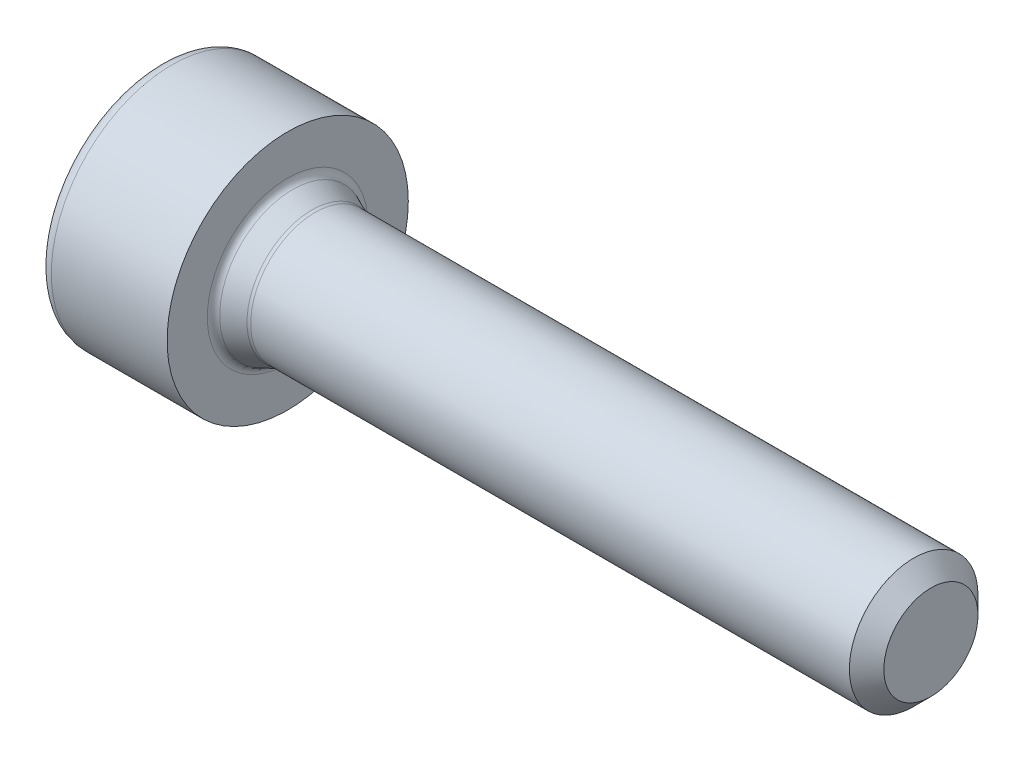
ISO-10303-21;
HEADER;
FILE_DESCRIPTION(('STEP AP214'),'2;1');
FILE_NAME('part.step','',(''),(''),'','','');
FILE_SCHEMA(('AUTOMOTIVE_DESIGN { 1 0 10303 214 1 1 1 1 }'));
ENDSEC;
DATA;
#1=APPLICATION_CONTEXT('core data for automotive mechanical design processes');
#2=APPLICATION_PROTOCOL_DEFINITION('international standard','automotive_design',2000,#1);
#3=PRODUCT_CONTEXT('',#1,'mechanical');
#4=PRODUCT('Part','Part','',(#3));
#5=PRODUCT_RELATED_PRODUCT_CATEGORY('part','',(#4));
#6=PRODUCT_DEFINITION_FORMATION('','',#4);
#7=PRODUCT_DEFINITION_CONTEXT('part definition',#1,'design');
#8=PRODUCT_DEFINITION('design','',#6,#7);
#9=PRODUCT_DEFINITION_SHAPE('','',#8);
#10=(LENGTH_UNIT() NAMED_UNIT(*) SI_UNIT(.MILLI.,.METRE.));
#11=(NAMED_UNIT(*) PLANE_ANGLE_UNIT() SI_UNIT($,.RADIAN.));
#12=(NAMED_UNIT(*) SI_UNIT($,.STERADIAN.) SOLID_ANGLE_UNIT());
#13=UNCERTAINTY_MEASURE_WITH_UNIT(LENGTH_MEASURE(1.E-05),#10,'distance_accuracy_value','');
#14=(GEOMETRIC_REPRESENTATION_CONTEXT(3) GLOBAL_UNCERTAINTY_ASSIGNED_CONTEXT((#13)) GLOBAL_UNIT_ASSIGNED_CONTEXT((#10,
#11,#12)) REPRESENTATION_CONTEXT('',''));
#15=CARTESIAN_POINT('',(0.,0.,0.));
#16=DIRECTION('',(0.,0.,1.));
#17=DIRECTION('',(1.,0.,0.));
#18=AXIS2_PLACEMENT_3D('',#15,#16,#17);
#19=CARTESIAN_POINT('',(-0.9,0.,0.));
#20=DIRECTION('',(-1.,0.,0.));
#21=DIRECTION('',(0.,0.,1.));
#22=AXIS2_PLACEMENT_3D('',#19,#20,#21);
#23=CONICAL_SURFACE('',#22,0.75,1.0471975511966);
#24=CARTESIAN_POINT('',(-0.9,0.,0.));
#25=DIRECTION('',(1.,0.,0.));
#26=DIRECTION('',(0.,0.,-1.));
#27=AXIS2_PLACEMENT_3D('',#24,#25,#26);
#28=CIRCLE('',#27,0.75);
#29=CARTESIAN_POINT('',(-0.9,0.,-0.75));
#30=VERTEX_POINT('',#29);
#31=CARTESIAN_POINT('',(-0.9,0.649519052838329,-0.375));
#32=VERTEX_POINT('',#31);
#33=EDGE_CURVE('E318',#30,#32,#28,.T.);
#34=ORIENTED_EDGE('',*,*,#33,.F.);
#35=CARTESIAN_POINT('',(-0.9,0.,0.));
#36=DIRECTION('',(1.,0.,0.));
#37=DIRECTION('',(0.,0.,1.));
#38=AXIS2_PLACEMENT_3D('',#35,#36,#37);
#39=CIRCLE('',#38,0.75);
#40=CARTESIAN_POINT('',(-0.9,-0.649519052838329,-0.375));
#41=VERTEX_POINT('',#40);
#42=EDGE_CURVE('E311',#41,#30,#39,.T.);
#43=ORIENTED_EDGE('',*,*,#42,.F.);
#44=CARTESIAN_POINT('',(-0.9,0.,0.));
#45=DIRECTION('',(1.,0.,0.));
#46=DIRECTION('',(0.,0.,1.));
#47=AXIS2_PLACEMENT_3D('',#44,#45,#46);
#48=CIRCLE('',#47,0.75);
#49=CARTESIAN_POINT('',(-0.9,-0.649519052838329,0.375));
#50=VERTEX_POINT('',#49);
#51=EDGE_CURVE('E620',#50,#41,#48,.T.);
#52=ORIENTED_EDGE('',*,*,#51,.F.);
#53=CARTESIAN_POINT('',(-0.9,0.,0.));
#54=DIRECTION('',(1.,0.,0.));
#55=DIRECTION('',(0.,0.,1.));
#56=AXIS2_PLACEMENT_3D('',#53,#54,#55);
#57=CIRCLE('',#56,0.75);
#58=CARTESIAN_POINT('',(-0.9,0.,0.75));
#59=VERTEX_POINT('',#58);
#60=EDGE_CURVE('E623',#59,#50,#57,.T.);
#61=ORIENTED_EDGE('',*,*,#60,.F.);
#62=CARTESIAN_POINT('',(-0.9,0.,0.));
#63=DIRECTION('',(1.,0.,0.));
#64=DIRECTION('',(0.,0.,1.));
#65=AXIS2_PLACEMENT_3D('',#62,#63,#64);
#66=CIRCLE('',#65,0.75);
#67=CARTESIAN_POINT('',(-0.9,0.649519052838329,0.375));
#68=VERTEX_POINT('',#67);
#69=EDGE_CURVE('E11',#68,#59,#66,.T.);
#70=ORIENTED_EDGE('',*,*,#69,.F.);
#71=CARTESIAN_POINT('',(-0.9,0.,0.));
#72=DIRECTION('',(1.,0.,0.));
#73=DIRECTION('',(0.,0.,1.));
#74=AXIS2_PLACEMENT_3D('',#71,#72,#73);
#75=CIRCLE('',#74,0.75);
#76=EDGE_CURVE('E279',#32,#68,#75,.T.);
#77=ORIENTED_EDGE('',*,*,#76,.F.);
#78=EDGE_LOOP('',(#34,#43,#52,#61,#70,#77));
#79=FACE_BOUND('',#78,.T.);
#80=CARTESIAN_POINT('',(-0.466987298107781,0.,0.));
#81=VERTEX_POINT('',#80);
#82=VERTEX_LOOP('',#81);
#83=FACE_BOUND('',#82,.T.);
#84=ADVANCED_FACE('F16',(#79,#83),#23,.F.);
#85=CARTESIAN_POINT('',(-0.9,0.75,0.));
#86=DIRECTION('',(-1.,0.,0.));
#87=DIRECTION('',(0.,0.,1.));
#88=AXIS2_PLACEMENT_3D('',#85,#86,#87);
#89=PLANE('',#88);
#90=DIRECTION('',(0.,-0.5,0.866025403784439));
#91=VECTOR('',#90,1.);
#92=CARTESIAN_POINT('',(-0.9,0.866025403784439,0.));
#93=LINE('',#92,#91);
#94=CARTESIAN_POINT('',(-0.9,0.433012701892219,0.75));
#95=VERTEX_POINT('',#94);
#96=EDGE_CURVE('E28',#68,#95,#93,.T.);
#97=ORIENTED_EDGE('',*,*,#96,.F.);
#98=ORIENTED_EDGE('',*,*,#69,.T.);
#99=DIRECTION('',(0.,-1.,0.));
#100=VECTOR('',#99,1.);
#101=CARTESIAN_POINT('',(-0.9,0.433012701892219,0.75));
#102=LINE('',#101,#100);
#103=EDGE_CURVE('E116',#95,#59,#102,.T.);
#104=ORIENTED_EDGE('',*,*,#103,.F.);
#105=EDGE_LOOP('',(#97,#98,#104));
#106=FACE_BOUND('',#105,.T.);
#107=ADVANCED_FACE('F18',(#106),#89,.T.);
#108=CARTESIAN_POINT('',(-0.9,0.866025403784439,0.));
#109=DIRECTION('',(0.,-0.866025403784439,-0.5));
#110=DIRECTION('',(0.,0.5,-0.866025403784439));
#111=AXIS2_PLACEMENT_3D('',#108,#109,#110);
#112=PLANE('',#111);
#113=CARTESIAN_POINT('',(-1.58904501176617,0.866025403782683,-5.78758739838344E-13));
#114=CARTESIAN_POINT('',(-1.58367531613561,0.856723474156551,0.0161105205743026));
#115=CARTESIAN_POINT('',(-1.57854220470905,0.84738450763052,0.0322814872921372));
#116=CARTESIAN_POINT('',(-1.56897580041662,0.828935657126255,0.0642729405519347));
#117=CARTESIAN_POINT('',(-1.56452615681788,0.819827285483137,0.0800894255372696));
#118=CARTESIAN_POINT('',(-1.55632470104139,0.801806998337829,0.111473630036228));
#119=CARTESIAN_POINT('',(-1.55255844098719,0.792895748391182,0.127037926390042));
#120=CARTESIAN_POINT('',(-1.54572175112771,0.775220861861013,0.158023870009516));
#121=CARTESIAN_POINT('',(-1.54264016162135,0.766457411337308,0.173443148980513));
#122=CARTESIAN_POINT('',(-1.53716899215381,0.749009737194211,0.20424921261375));
#123=CARTESIAN_POINT('',(-1.53477305532817,0.740325560294707,0.219634889191484));
#124=CARTESIAN_POINT('',(-1.53066792088133,0.722945779473704,0.250484378573551));
#125=CARTESIAN_POINT('',(-1.52895848861601,0.714250180477494,0.265948162848017));
#126=CARTESIAN_POINT('',(-1.52621989095727,0.696732411765656,0.297061699794271));
#127=CARTESIAN_POINT('',(-1.5251974313371,0.687909829363522,0.312711809862034));
#128=CARTESIAN_POINT('',(-1.52382556634571,0.669996724020713,0.344298582621984));
#129=CARTESIAN_POINT('',(-1.52348988324408,0.660904354086726,0.360234785944158));
#130=CARTESIAN_POINT('',(-1.5234852263274,0.642551029489878,0.392020450873912));
#131=CARTESIAN_POINT('',(-1.52381658291048,0.633289993534913,0.407869865594268));
#132=CARTESIAN_POINT('',(-1.52518115027885,0.614880324039069,0.43919075916239));
#133=CARTESIAN_POINT('',(-1.52620060432808,0.605733000926372,0.454663599548));
#134=CARTESIAN_POINT('',(-1.52893439533168,0.587536787625666,0.485406031007776));
#135=CARTESIAN_POINT('',(-1.53064202248997,0.578487789606331,0.500676154434751));
#136=CARTESIAN_POINT('',(-1.53474475290455,0.560451924019377,0.531168265230114));
#137=CARTESIAN_POINT('',(-1.53714011485072,0.551465081136355,0.546390232302254));
#138=CARTESIAN_POINT('',(-1.54261130390451,0.533500857145195,0.576921281388262));
#139=CARTESIAN_POINT('',(-1.54569353528851,0.524524421858133,0.592229766578065));
#140=CARTESIAN_POINT('',(-1.55253266004756,0.506517382166265,0.623049878304814));
#141=CARTESIAN_POINT('',(-1.55630077603232,0.497488748182276,0.638560153373553));
#142=CARTESIAN_POINT('',(-1.56450707862101,0.479308068903913,0.669881243679906));
#143=CARTESIAN_POINT('',(-1.56895978288347,0.47015866433642,0.685689757997303));
#144=CARTESIAN_POINT('',(-1.57853345250863,0.451664094576124,0.717688588002265));
#145=CARTESIAN_POINT('',(-1.58367083878027,0.442321638119278,0.733875572129299));
#146=CARTESIAN_POINT('',(-1.58904501176668,0.433012701891488,0.749999999999412));
#147=B_SPLINE_CURVE_WITH_KNOTS('',3,(#113,#114,#115,#116,#117,#118,#119,#120,#121,#122,#123,
#124,#125,#126,#127,#128,#129,#130,#131,#132,#133,#134,#135,#136,#137,#138,#139,#140,#141,#142,
#143,#144,#145,#146),.UNSPECIFIED.,.F.,.F.,(4,2,2,2,2,2,2,2,2,2,2,2,2,2,2,2,4),(0.,
0.0580897344636607,0.114440335586993,0.169407773207459,0.223399996272083,0.276874101131342,
0.33032991319819,0.384300225592538,0.439338768230825,0.494404579270198,0.548400876597368,
0.601882969120034,0.65538520522544,0.709408872876216,0.764412383870848,0.820804823497777,
0.878943109631919),.UNSPECIFIED.);
#148=CARTESIAN_POINT('',(-1.58904501176718,0.866025403784439,0.));
#149=VERTEX_POINT('',#148);
#150=CARTESIAN_POINT('',(-1.58904501176718,0.433012701892219,0.75));
#151=VERTEX_POINT('',#150);
#152=EDGE_CURVE('E262',#149,#151,#147,.T.);
#153=ORIENTED_EDGE('',*,*,#152,.F.);
#154=DIRECTION('',(-1.,0.,0.));
#155=VECTOR('',#154,1.);
#156=CARTESIAN_POINT('',(-0.9,0.866025403784439,0.));
#157=LINE('',#156,#155);
#158=CARTESIAN_POINT('',(-0.9,0.866025403784439,0.));
#159=VERTEX_POINT('',#158);
#160=EDGE_CURVE('E123',#159,#149,#157,.T.);
#161=ORIENTED_EDGE('',*,*,#160,.F.);
#162=DIRECTION('',(0.,-0.5,0.866025403784439));
#163=VECTOR('',#162,1.);
#164=CARTESIAN_POINT('',(-0.9,0.866025403784439,0.));
#165=LINE('',#164,#163);
#166=EDGE_CURVE('E271',#159,#68,#165,.T.);
#167=ORIENTED_EDGE('',*,*,#166,.T.);
#168=ORIENTED_EDGE('',*,*,#96,.T.);
#169=DIRECTION('',(-1.,0.,0.));
#170=VECTOR('',#169,1.);
#171=CARTESIAN_POINT('',(-0.9,0.433012701892219,0.75));
#172=LINE('',#171,#170);
#173=EDGE_CURVE('E107',#95,#151,#172,.T.);
#174=ORIENTED_EDGE('',*,*,#173,.T.);
#175=EDGE_LOOP('',(#153,#161,#167,#168,#174));
#176=FACE_BOUND('',#175,.T.);
#177=ADVANCED_FACE('F402',(#176),#112,.T.);
#178=CARTESIAN_POINT('',(-0.9,0.433012701892219,-0.75));
#179=DIRECTION('',(0.,-0.866025403784439,0.5));
#180=DIRECTION('',(-1.,0.,0.));
#181=AXIS2_PLACEMENT_3D('',#178,#179,#180);
#182=PLANE('',#181);
#183=CARTESIAN_POINT('',(-1.58904501176617,0.433012701890843,-0.749999999998768));
#184=CARTESIAN_POINT('',(-1.58367531613567,0.442313857163721,-0.733889032351043));
#185=CARTESIAN_POINT('',(-1.57854220470916,0.451648841882024,-0.71771576673566));
#186=CARTESIAN_POINT('',(-1.56897580041683,0.470129827856745,-0.68574286689874));
#187=CARTESIAN_POINT('',(-1.56452615681813,0.479273119831028,-0.669946543176147));
#188=CARTESIAN_POINT('',(-1.5563247010417,0.497442494632006,-0.638648414475542));
#189=CARTESIAN_POINT('',(-1.55255844098752,0.506465945693117,-0.623148897465443));
#190=CARTESIAN_POINT('',(-1.54572175112808,0.524463116762755,-0.592349024911677));
#191=CARTESIAN_POINT('',(-1.54264016162172,0.533434878797849,-0.57705001464787));
#192=CARTESIAN_POINT('',(-1.53716899215418,0.551389875423344,-0.546536853786382));
#193=CARTESIAN_POINT('',(-1.53477305532854,0.560372173744356,-0.531323297691564));
#194=CARTESIAN_POINT('',(-1.53066792088167,0.578398724832574,-0.500847221297241));
#195=CARTESIAN_POINT('',(-1.52895848861632,0.587442955354833,-0.485584719528094));
#196=CARTESIAN_POINT('',(-1.52621989095752,0.605629184396017,-0.4548571183327));
#197=CARTESIAN_POINT('',(-1.52519743133731,0.614771286085682,-0.439391482811466));
#198=CARTESIAN_POINT('',(-1.52382556634582,0.633169681047983,-0.408084892143652));
#199=CARTESIAN_POINT('',(-1.52348988324413,0.64242465299786,-0.392242567138949));
#200=CARTESIAN_POINT('',(-1.52348522632734,0.660775184004618,-0.360455289329204));
#201=CARTESIAN_POINT('',(-1.52381658291036,0.669870661809922,-0.34451028956675));
#202=CARTESIAN_POINT('',(-1.52518115027863,0.687790516560974,-0.312906601324182));
#203=CARTESIAN_POINT('',(-1.52620060432783,0.696616727847172,-0.297248366939241));
#204=CARTESIAN_POINT('',(-1.52893439533137,0.714142347814949,-0.266118768238413));
#205=CARTESIAN_POINT('',(-1.53064202248963,0.72284216361192,-0.250647044361453));
#206=CARTESIAN_POINT('',(-1.53474475290418,0.740231173382189,-0.219781471186337));
#207=CARTESIAN_POINT('',(-1.53714011485035,0.748920362120719,-0.204387653413792));
#208=CARTESIAN_POINT('',(-1.54261130390413,0.766378914237847,-0.17356465453522));
#209=CARTESIAN_POINT('',(-1.54569353528814,0.77514823366218,-0.158136590946302));
#210=CARTESIAN_POINT('',(-1.55253266004722,0.792835713519189,-0.127131981262786));
#211=CARTESIAN_POINT('',(-1.55630077603201,0.801753688756474,-0.111557817336774));
#212=CARTESIAN_POINT('',(-1.56450707862076,0.819788208996979,-0.0801523420703491));
#213=CARTESIAN_POINT('',(-1.56895978288327,0.82890408170828,-0.0643244681266093));
#214=CARTESIAN_POINT('',(-1.57853345250852,0.847368596504008,-0.0323082858794039));
#215=CARTESIAN_POINT('',(-1.58367083878022,0.856715707740358,-0.0161239891903555));
#216=CARTESIAN_POINT('',(-1.58904501176668,0.866025403783564,3.39263646639654E-13));
#217=B_SPLINE_CURVE_WITH_KNOTS('',3,(#183,#184,#185,#186,#187,#188,#189,#190,#191,#192,#193,
#194,#195,#196,#197,#198,#199,#200,#201,#202,#203,#204,#205,#206,#207,#208,#209,#210,#211,#212,
#213,#214,#215,#216),.UNSPECIFIED.,.F.,.F.,(4,2,2,2,2,2,2,2,2,2,2,2,2,2,2,2,4),(0.,
0.0580897344630765,0.114440335586018,0.169407773206276,0.223399996270862,0.276874101130235,
0.330329913197332,0.384300225592043,0.439338768230785,0.494404579269703,0.548400876596509,
0.601882969118926,0.655385205224217,0.709408872875031,0.76441238386987,0.820804823497191,
0.878943109631917),.UNSPECIFIED.);
#218=CARTESIAN_POINT('',(-1.58904501176718,0.433012701892219,-0.75));
#219=VERTEX_POINT('',#218);
#220=EDGE_CURVE('E130',#219,#149,#217,.T.);
#221=ORIENTED_EDGE('',*,*,#220,.F.);
#222=DIRECTION('',(-1.,0.,0.));
#223=VECTOR('',#222,1.);
#224=CARTESIAN_POINT('',(-0.9,0.433012701892219,-0.75));
#225=LINE('',#224,#223);
#226=CARTESIAN_POINT('',(-0.9,0.433012701892219,-0.75));
#227=VERTEX_POINT('',#226);
#228=EDGE_CURVE('E244',#227,#219,#225,.T.);
#229=ORIENTED_EDGE('',*,*,#228,.F.);
#230=DIRECTION('',(0.,0.5,0.866025403784439));
#231=VECTOR('',#230,1.);
#232=CARTESIAN_POINT('',(-0.9,0.433012701892219,-0.75));
#233=LINE('',#232,#231);
#234=EDGE_CURVE('E313',#227,#32,#233,.T.);
#235=ORIENTED_EDGE('',*,*,#234,.T.);
#236=DIRECTION('',(0.,0.5,0.866025403784439));
#237=VECTOR('',#236,1.);
#238=CARTESIAN_POINT('',(-0.9,0.433012701892219,-0.75));
#239=LINE('',#238,#237);
#240=EDGE_CURVE('E317',#32,#159,#239,.T.);
#241=ORIENTED_EDGE('',*,*,#240,.T.);
#242=ORIENTED_EDGE('',*,*,#160,.T.);
#243=EDGE_LOOP('',(#221,#229,#235,#241,#242));
#244=FACE_BOUND('',#243,.T.);
#245=ADVANCED_FACE('F494',(#244),#182,.T.);
#246=CARTESIAN_POINT('',(-0.9,-0.433012701892219,-0.75));
#247=DIRECTION('',(0.,0.,1.));
#248=DIRECTION('',(1.,0.,0.));
#249=AXIS2_PLACEMENT_3D('',#246,#247,#248);
#250=PLANE('',#249);
#251=CARTESIAN_POINT('',(-1.58904501176718,-0.433012701892222,-0.749999999999998));
#252=CARTESIAN_POINT('',(-1.5836766178328,-0.414414218634009,-0.749999523021776));
#253=CARTESIAN_POINT('',(-1.57854539094546,-0.395744699761326,-0.749998669196846));
#254=CARTESIAN_POINT('',(-1.56898280315234,-0.358820240384285,-0.750022352782509));
#255=CARTESIAN_POINT('',(-1.56453515468041,-0.340569504010301,-0.750046135044975));
#256=CARTESIAN_POINT('',(-1.55633774328368,-0.304378137843782,-0.750140974612984));
#257=CARTESIAN_POINT('',(-1.55257361978297,-0.286440783248513,-0.750210866250142));
#258=CARTESIAN_POINT('',(-1.54574122348698,-0.250759790476764,-0.750407936177468));
#259=CARTESIAN_POINT('',(-1.5426619045163,-0.233018272192063,-0.7505340882642));
#260=CARTESIAN_POINT('',(-1.53719527340424,-0.197599279685931,-0.750838801374382));
#261=CARTESIAN_POINT('',(-1.53480174068341,-0.17992276591461,-0.751016859660493));
#262=CARTESIAN_POINT('',(-1.53070138843517,-0.144492557517089,-0.751401443551943));
#263=CARTESIAN_POINT('',(-1.52899448543216,-0.126738872538248,-0.751607965692747));
#264=CARTESIAN_POINT('',(-1.52626091765833,-0.0910032782259369,-0.752002919663614));
#265=CARTESIAN_POINT('',(-1.52524111312707,-0.0730208424177079,-0.752191153444209));
#266=CARTESIAN_POINT('',(-1.52387450152645,-0.0366698820758176,-0.752476522891336));
#267=CARTESIAN_POINT('',(-1.52354156123283,-0.0183008282307069,-0.752571761453416));
#268=CARTESIAN_POINT('',(-1.52354238435663,0.0184282188321439,-0.752569857650806));
#269=CARTESIAN_POINT('',(-1.5238758198446,0.0367882120613368,-0.752472809912114));
#270=CARTESIAN_POINT('',(-1.5252433624702,0.0731221315815553,-0.752185035572589));
#271=CARTESIAN_POINT('',(-1.5262636397777,0.0910965862649876,-0.751996178067135));
#272=CARTESIAN_POINT('',(-1.52899790499123,0.126817244120297,-0.751600584592368));
#273=CARTESIAN_POINT('',(-1.53070507304843,0.144563970982512,-0.751394039658522));
#274=CARTESIAN_POINT('',(-1.53480575682571,0.17998122863539,-0.751009859433507));
#275=CARTESIAN_POINT('',(-1.53719939323615,0.19765174547231,-0.750832229234552));
#276=CARTESIAN_POINT('',(-1.54266602457155,0.233059649440022,-0.750528589244018));
#277=CARTESIAN_POINT('',(-1.5457452719356,0.250796070889233,-0.750403087140767));
#278=CARTESIAN_POINT('',(-1.55257732811481,0.286467719094294,-0.75020735368119));
#279=CARTESIAN_POINT('',(-1.55634120821914,0.304400820639449,-0.75013815200652));
#280=CARTESIAN_POINT('',(-1.56453794081843,0.340584480455502,-0.750044552605956));
#281=CARTESIAN_POINT('',(-1.56898517184782,0.358831758940779,-0.750021318897463));
#282=CARTESIAN_POINT('',(-1.57854674645101,0.395750057558846,-0.749998434391471));
#283=CARTESIAN_POINT('',(-1.58367738931713,0.414416870264323,-0.749999530147659));
#284=CARTESIAN_POINT('',(-1.58904501176718,0.433012701892221,-0.749999999999995));
#285=B_SPLINE_CURVE_WITH_KNOTS('',3,(#251,#252,#253,#254,#255,#256,#257,#258,#259,#260,#261,
#262,#263,#264,#265,#266,#267,#268,#269,#270,#271,#272,#273,#274,#275,#276,#277,#278,#279,#280,
#281,#282,#283,#284),.UNSPECIFIED.,.F.,.F.,(4,2,2,2,2,2,2,2,2,2,2,2,2,2,2,2,4),(0.,
0.0580753806633286,0.114421839483928,0.169395773357731,0.223405562650817,0.27690869861218,
0.330405328071952,0.384428471042768,0.43953199397489,0.494608406651249,0.548607746758201,
0.60208368241486,0.655569025628609,0.709563708155784,0.764525006769336,0.820861098110479,
0.878928195887142),.UNSPECIFIED.);
#286=CARTESIAN_POINT('',(-1.58904501176718,-0.433012701892219,-0.75));
#287=VERTEX_POINT('',#286);
#288=EDGE_CURVE('E260',#287,#219,#285,.T.);
#289=ORIENTED_EDGE('',*,*,#288,.F.);
#290=DIRECTION('',(-1.,0.,0.));
#291=VECTOR('',#290,1.);
#292=CARTESIAN_POINT('',(-0.9,-0.433012701892219,-0.75));
#293=LINE('',#292,#291);
#294=CARTESIAN_POINT('',(-0.9,-0.433012701892219,-0.75));
#295=VERTEX_POINT('',#294);
#296=EDGE_CURVE('E236',#295,#287,#293,.T.);
#297=ORIENTED_EDGE('',*,*,#296,.F.);
#298=DIRECTION('',(0.,1.,0.));
#299=VECTOR('',#298,1.);
#300=CARTESIAN_POINT('',(-0.9,-0.433012701892219,-0.75));
#301=LINE('',#300,#299);
#302=EDGE_CURVE('E319',#295,#30,#301,.T.);
#303=ORIENTED_EDGE('',*,*,#302,.T.);
#304=DIRECTION('',(0.,1.,0.));
#305=VECTOR('',#304,1.);
#306=CARTESIAN_POINT('',(-0.9,-0.433012701892219,-0.75));
#307=LINE('',#306,#305);
#308=EDGE_CURVE('E322',#30,#227,#307,.T.);
#309=ORIENTED_EDGE('',*,*,#308,.T.);
#310=ORIENTED_EDGE('',*,*,#228,.T.);
#311=EDGE_LOOP('',(#289,#297,#303,#309,#310));
#312=FACE_BOUND('',#311,.T.);
#313=ADVANCED_FACE('F486',(#312),#250,.T.);
#314=CARTESIAN_POINT('',(-0.9,-0.866025403784439,0.));
#315=DIRECTION('',(0.,0.866025403784439,0.5));
#316=DIRECTION('',(1.,0.,0.));
#317=AXIS2_PLACEMENT_3D('',#314,#315,#316);
#318=PLANE('',#317);
#319=CARTESIAN_POINT('',(-1.58904501176617,-0.866025403782683,5.80575645000851E-13));
#320=CARTESIAN_POINT('',(-1.58367531613561,-0.856723474156551,-0.0161105205743008));
#321=CARTESIAN_POINT('',(-1.57854220470905,-0.84738450763052,-0.0322814872921357));
#322=CARTESIAN_POINT('',(-1.56897580041662,-0.828935657126255,-0.0642729405519336));
#323=CARTESIAN_POINT('',(-1.56452615681788,-0.819827285483137,-0.0800894255372687));
#324=CARTESIAN_POINT('',(-1.55632470104139,-0.801806998337829,-0.111473630036227));
#325=CARTESIAN_POINT('',(-1.55255844098719,-0.792895748391181,-0.127037926390041));
#326=CARTESIAN_POINT('',(-1.54572175112771,-0.775220861861013,-0.158023870009515));
#327=CARTESIAN_POINT('',(-1.54264016162135,-0.766457411337308,-0.173443148980513));
#328=CARTESIAN_POINT('',(-1.53716899215381,-0.749009737194211,-0.20424921261375));
#329=CARTESIAN_POINT('',(-1.53477305532817,-0.740325560294707,-0.219634889191484));
#330=CARTESIAN_POINT('',(-1.53066792088133,-0.722945779473704,-0.250484378573551));
#331=CARTESIAN_POINT('',(-1.52895848861601,-0.714250180477493,-0.265948162848017));
#332=CARTESIAN_POINT('',(-1.52621989095727,-0.696732411765656,-0.297061699794272));
#333=CARTESIAN_POINT('',(-1.5251974313371,-0.687909829363521,-0.312711809862035));
#334=CARTESIAN_POINT('',(-1.52382556634571,-0.669996724020712,-0.344298582621986));
#335=CARTESIAN_POINT('',(-1.52348988324408,-0.660904354086725,-0.360234785944159));
#336=CARTESIAN_POINT('',(-1.5234852263274,-0.642551029489877,-0.392020450873913));
#337=CARTESIAN_POINT('',(-1.52381658291048,-0.633289993534912,-0.407869865594269));
#338=CARTESIAN_POINT('',(-1.52518115027885,-0.614880324039068,-0.439190759162391));
#339=CARTESIAN_POINT('',(-1.52620060432808,-0.605733000926371,-0.454663599548001));
#340=CARTESIAN_POINT('',(-1.52893439533168,-0.587536787625665,-0.485406031007777));
#341=CARTESIAN_POINT('',(-1.53064202248997,-0.57848778960633,-0.500676154434753));
#342=CARTESIAN_POINT('',(-1.53474475290455,-0.560451924019376,-0.531168265230115));
#343=CARTESIAN_POINT('',(-1.53714011485072,-0.551465081136354,-0.546390232302255));
#344=CARTESIAN_POINT('',(-1.54261130390451,-0.533500857145194,-0.576921281388263));
#345=CARTESIAN_POINT('',(-1.54569353528851,-0.524524421858132,-0.592229766578066));
#346=CARTESIAN_POINT('',(-1.55253266004756,-0.506517382166265,-0.623049878304815));
#347=CARTESIAN_POINT('',(-1.55630077603232,-0.497488748182276,-0.638560153373553));
#348=CARTESIAN_POINT('',(-1.56450707862101,-0.479308068903912,-0.669881243679906));
#349=CARTESIAN_POINT('',(-1.56895978288347,-0.470158664336419,-0.685689757997303));
#350=CARTESIAN_POINT('',(-1.57853345250863,-0.451664094576123,-0.717688588002266));
#351=CARTESIAN_POINT('',(-1.58367083878027,-0.442321638119278,-0.733875572129299));
#352=CARTESIAN_POINT('',(-1.58904501176668,-0.433012701891488,-0.749999999999412));
#353=B_SPLINE_CURVE_WITH_KNOTS('',3,(#319,#320,#321,#322,#323,#324,#325,#326,#327,#328,#329,
#330,#331,#332,#333,#334,#335,#336,#337,#338,#339,#340,#341,#342,#343,#344,#345,#346,#347,#348,
#349,#350,#351,#352),.UNSPECIFIED.,.F.,.F.,(4,2,2,2,2,2,2,2,2,2,2,2,2,2,2,2,4),(0.,
0.058089734463661,0.114440335586993,0.16940777320746,0.223399996272085,0.276874101131344,
0.330329913198193,0.384300225592541,0.439338768230828,0.494404579270201,0.548400876597371,
0.601882969120037,0.655385205225443,0.709408872876219,0.76441238387085,0.820804823497779,
0.878943109631921),.UNSPECIFIED.);
#354=CARTESIAN_POINT('',(-1.58904501176718,-0.866025403784439,0.));
#355=VERTEX_POINT('',#354);
#356=EDGE_CURVE('E255',#355,#287,#353,.T.);
#357=ORIENTED_EDGE('',*,*,#356,.F.);
#358=DIRECTION('',(-1.,0.,0.));
#359=VECTOR('',#358,1.);
#360=CARTESIAN_POINT('',(-0.9,-0.866025403784439,0.));
#361=LINE('',#360,#359);
#362=CARTESIAN_POINT('',(-0.9,-0.866025403784439,0.));
#363=VERTEX_POINT('',#362);
#364=EDGE_CURVE('E228',#363,#355,#361,.T.);
#365=ORIENTED_EDGE('',*,*,#364,.F.);
#366=DIRECTION('',(0.,0.5,-0.866025403784439));
#367=VECTOR('',#366,1.);
#368=CARTESIAN_POINT('',(-0.9,-0.866025403784439,0.));
#369=LINE('',#368,#367);
#370=EDGE_CURVE('E312',#363,#41,#369,.T.);
#371=ORIENTED_EDGE('',*,*,#370,.T.);
#372=DIRECTION('',(0.,0.5,-0.866025403784439));
#373=VECTOR('',#372,1.);
#374=CARTESIAN_POINT('',(-0.9,-0.866025403784439,0.));
#375=LINE('',#374,#373);
#376=EDGE_CURVE('E308',#41,#295,#375,.T.);
#377=ORIENTED_EDGE('',*,*,#376,.T.);
#378=ORIENTED_EDGE('',*,*,#296,.T.);
#379=EDGE_LOOP('',(#357,#365,#371,#377,#378));
#380=FACE_BOUND('',#379,.T.);
#381=ADVANCED_FACE('F213',(#380),#318,.T.);
#382=CARTESIAN_POINT('',(-0.9,-0.433012701892219,0.75));
#383=DIRECTION('',(0.,0.866025403784439,-0.5));
#384=DIRECTION('',(-1.,0.,0.));
#385=AXIS2_PLACEMENT_3D('',#382,#383,#384);
#386=PLANE('',#385);
#387=CARTESIAN_POINT('',(-1.58904501176617,-0.433012701890845,0.749999999998766));
#388=CARTESIAN_POINT('',(-1.58367531613566,-0.442313857163741,0.733889032351012));
#389=CARTESIAN_POINT('',(-1.57854220470914,-0.451648841882058,0.717715766735598));
#390=CARTESIAN_POINT('',(-1.56897580041679,-0.470129827856799,0.685742866898625));
#391=CARTESIAN_POINT('',(-1.56452615681809,-0.479273119831087,0.669946543176009));
#392=CARTESIAN_POINT('',(-1.55632470104164,-0.49744249463207,0.638648414475369));
#393=CARTESIAN_POINT('',(-1.55255844098746,-0.506465945693181,0.623148897465256));
#394=CARTESIAN_POINT('',(-1.54572175112801,-0.524463116762813,0.592349024911471));
#395=CARTESIAN_POINT('',(-1.54264016162166,-0.533434878797904,0.577050014647659));
#396=CARTESIAN_POINT('',(-1.53716899215411,-0.551389875423387,0.546536853786171));
#397=CARTESIAN_POINT('',(-1.53477305532847,-0.560372173744392,0.531323297691357));
#398=CARTESIAN_POINT('',(-1.53066792088161,-0.578398724832596,0.500847221297052));
#399=CARTESIAN_POINT('',(-1.52895848861626,-0.587442955354849,0.485584719527919));
#400=CARTESIAN_POINT('',(-1.52621989095748,-0.605629184396022,0.454857118332561));
#401=CARTESIAN_POINT('',(-1.52519743133727,-0.614771286085682,0.43939148281135));
#402=CARTESIAN_POINT('',(-1.5238255663458,-0.633169681047978,0.408084892143591));
#403=CARTESIAN_POINT('',(-1.52348988324412,-0.642424652997856,0.392242567138921));
#404=CARTESIAN_POINT('',(-1.52348522632735,-0.660775184004645,0.360455289329194));
#405=CARTESIAN_POINT('',(-1.52381658291039,-0.669870661809978,0.344510289566723));
#406=CARTESIAN_POINT('',(-1.52518115027867,-0.687790516561075,0.312906601324124));
#407=CARTESIAN_POINT('',(-1.52620060432788,-0.696616727847291,0.297248366939166));
#408=CARTESIAN_POINT('',(-1.52893439533143,-0.714142347815094,0.26611876823831));
#409=CARTESIAN_POINT('',(-1.53064202248969,-0.722842163612073,0.250647044361338));
#410=CARTESIAN_POINT('',(-1.53474475290425,-0.740231173382351,0.219781471186201));
#411=CARTESIAN_POINT('',(-1.53714011485042,-0.748920362120882,0.204387653413649));
#412=CARTESIAN_POINT('',(-1.5426113039042,-0.766378914238003,0.173564654535067));
#413=CARTESIAN_POINT('',(-1.54569353528821,-0.775148233662329,0.158136590946148));
#414=CARTESIAN_POINT('',(-1.55253266004728,-0.792835713519319,0.127131981262637));
#415=CARTESIAN_POINT('',(-1.55630077603207,-0.801753688756592,0.111557817336632));
#416=CARTESIAN_POINT('',(-1.56450707862081,-0.819788208997068,0.0801523420702306));
#417=CARTESIAN_POINT('',(-1.56895978288331,-0.828904081708353,0.0643244681265078));
#418=CARTESIAN_POINT('',(-1.57853345250854,-0.847368596504044,0.0323082858793476));
#419=CARTESIAN_POINT('',(-1.58367083878023,-0.856715707740375,0.0161239891903274));
#420=CARTESIAN_POINT('',(-1.58904501176668,-0.866025403783564,-3.37831334014421E-13));
#421=B_SPLINE_CURVE_WITH_KNOTS('',3,(#387,#388,#389,#390,#391,#392,#393,#394,#395,#396,#397,
#398,#399,#400,#401,#402,#403,#404,#405,#406,#407,#408,#409,#410,#411,#412,#413,#414,#415,#416,
#417,#418,#419,#420),.UNSPECIFIED.,.F.,.F.,(4,2,2,2,2,2,2,2,2,2,2,2,2,2,2,2,4),(0.,
0.0580897344631828,0.114440335586193,0.169407773206489,0.223399996271081,0.276874101130432,
0.330329913197483,0.384300225592126,0.439338768230784,0.494404579269786,0.548400876596661,
0.601882969119124,0.655385205224437,0.709408872875244,0.764412383870046,0.820804823497293,
0.878943109631913),.UNSPECIFIED.);
#422=CARTESIAN_POINT('',(-1.58904501176718,-0.433012701892219,0.75));
#423=VERTEX_POINT('',#422);
#424=EDGE_CURVE('E253',#423,#355,#421,.T.);
#425=ORIENTED_EDGE('',*,*,#424,.F.);
#426=DIRECTION('',(-1.,0.,0.));
#427=VECTOR('',#426,1.);
#428=CARTESIAN_POINT('',(-0.9,-0.433012701892219,0.75));
#429=LINE('',#428,#427);
#430=CARTESIAN_POINT('',(-0.9,-0.433012701892219,0.75));
#431=VERTEX_POINT('',#430);
#432=EDGE_CURVE('E120',#431,#423,#429,.T.);
#433=ORIENTED_EDGE('',*,*,#432,.F.);
#434=DIRECTION('',(0.,-0.5,-0.866025403784439));
#435=VECTOR('',#434,1.);
#436=CARTESIAN_POINT('',(-0.9,-0.433012701892219,0.75));
#437=LINE('',#436,#435);
#438=EDGE_CURVE('E631',#431,#50,#437,.T.);
#439=ORIENTED_EDGE('',*,*,#438,.T.);
#440=DIRECTION('',(0.,-0.5,-0.866025403784439));
#441=VECTOR('',#440,1.);
#442=CARTESIAN_POINT('',(-0.9,-0.433012701892219,0.75));
#443=LINE('',#442,#441);
#444=EDGE_CURVE('E627',#50,#363,#443,.T.);
#445=ORIENTED_EDGE('',*,*,#444,.T.);
#446=ORIENTED_EDGE('',*,*,#364,.T.);
#447=EDGE_LOOP('',(#425,#433,#439,#445,#446));
#448=FACE_BOUND('',#447,.T.);
#449=ADVANCED_FACE('F207',(#448),#386,.T.);
#450=CARTESIAN_POINT('',(-0.9,0.433012701892219,0.75));
#451=DIRECTION('',(0.,0.,-1.));
#452=DIRECTION('',(0.,-1.,0.));
#453=AXIS2_PLACEMENT_3D('',#450,#451,#452);
#454=PLANE('',#453);
#455=CARTESIAN_POINT('',(-1.58904501176718,0.433012701892221,0.749999999999999));
#456=CARTESIAN_POINT('',(-1.58367671816797,0.414414548343993,0.749999528699569));
#457=CARTESIAN_POINT('',(-1.57854548249208,0.39574538994538,0.749998471901422));
#458=CARTESIAN_POINT('',(-1.5689828939903,0.358822354787164,0.750021493031097));
#459=CARTESIAN_POINT('',(-1.56453523882934,0.340572686141309,0.75004482271912));
#460=CARTESIAN_POINT('',(-1.55633782913611,0.304384159339135,0.750138650852681));
#461=CARTESIAN_POINT('',(-1.55257369502863,0.286448581029672,0.750207984615958));
#462=CARTESIAN_POINT('',(-1.54574129928039,0.250771845477035,0.750403988641894));
#463=CARTESIAN_POINT('',(-1.54266196822457,0.233032812880272,0.750529629574376));
#464=CARTESIAN_POINT('',(-1.53719533568999,0.197619499112006,0.750833516980745));
#465=CARTESIAN_POINT('',(-1.53480178725773,0.179946182625587,0.751011256650208));
#466=CARTESIAN_POINT('',(-1.53070143861276,0.144523079446302,0.751395570090394));
#467=CARTESIAN_POINT('',(-1.52899452712108,0.126773305616042,0.751602139181597));
#468=CARTESIAN_POINT('',(-1.52626094221333,0.0910462458910879,0.751997651375414));
#469=CARTESIAN_POINT('',(-1.52524110174284,0.0730684355188563,0.752186401823032));
#470=CARTESIAN_POINT('',(-1.52387455155815,0.0367274346085252,0.752473672612256));
#471=CARTESIAN_POINT('',(-1.52354168660617,0.018363715558689,0.752570316383609));
#472=CARTESIAN_POINT('',(-1.5235422737683,-0.0183653354045915,0.752571333692774));
#473=CARTESIAN_POINT('',(-1.52387578466018,-0.0367306673174199,0.752475690269858));
#474=CARTESIAN_POINT('',(-1.52524338868893,-0.0730745530376853,0.752189815041848));
#475=CARTESIAN_POINT('',(-1.52626362994416,-0.0910536360399915,0.75200147285704));
#476=CARTESIAN_POINT('',(-1.52899787762363,-0.126782833191999,0.751606434569645));
#477=CARTESIAN_POINT('',(-1.53070503686639,-0.144533473033134,0.751399934889516));
#478=CARTESIAN_POINT('',(-1.5348057234352,-0.17995783844746,0.751015480675274));
#479=CARTESIAN_POINT('',(-1.53719934360652,-0.197631553287903,0.750837530007556));
#480=CARTESIAN_POINT('',(-1.54266597230236,-0.233045136256172,0.750533060648276));
#481=CARTESIAN_POINT('',(-1.54574520685175,-0.250784042944729,0.75040704557093));
#482=CARTESIAN_POINT('',(-1.55257726195527,-0.286459946243364,0.750210242805366));
#483=CARTESIAN_POINT('',(-1.55634113052254,-0.304394822405449,0.75014048167245));
#484=CARTESIAN_POINT('',(-1.5645378627976,-0.34058131697155,0.75004586811263));
#485=CARTESIAN_POINT('',(-1.56898508600959,-0.358829660247359,0.750022180700232));
#486=CARTESIAN_POINT('',(-1.57854665746584,-0.395749375895277,0.749998632131717));
#487=CARTESIAN_POINT('',(-1.58367729020806,-0.414416544830338,0.749999524460393));
#488=CARTESIAN_POINT('',(-1.58904501176718,-0.433012701892219,0.749999999999995));
#489=B_SPLINE_CURVE_WITH_KNOTS('',3,(#455,#456,#457,#458,#459,#460,#461,#462,#463,#464,#465,
#466,#467,#468,#469,#470,#471,#472,#473,#474,#475,#476,#477,#478,#479,#480,#481,#482,#483,#484,
#485,#486,#487,#488),.UNSPECIFIED.,.F.,.F.,(4,2,2,2,2,2,2,2,2,2,2,2,2,2,2,2,4),(0.,
0.0580743494702885,0.114417704737932,0.169386427914126,0.223388868550547,0.276882496860493,
0.330367452295356,0.384376761184477,0.439464305172844,0.494556708381129,0.548569891197932,
0.602057506280393,0.655552359088874,0.709554388572309,0.764520892396891,0.820860077913133,
0.878928193536506),.UNSPECIFIED.);
#490=EDGE_CURVE('E191',#151,#423,#489,.T.);
#491=ORIENTED_EDGE('',*,*,#490,.F.);
#492=ORIENTED_EDGE('',*,*,#173,.F.);
#493=ORIENTED_EDGE('',*,*,#103,.T.);
#494=DIRECTION('',(0.,-1.,0.));
#495=VECTOR('',#494,1.);
#496=CARTESIAN_POINT('',(-0.9,0.433012701892219,0.75));
#497=LINE('',#496,#495);
#498=EDGE_CURVE('E636',#59,#431,#497,.T.);
#499=ORIENTED_EDGE('',*,*,#498,.T.);
#500=ORIENTED_EDGE('',*,*,#432,.T.);
#501=EDGE_LOOP('',(#491,#492,#493,#499,#500));
#502=FACE_BOUND('',#501,.T.);
#503=ADVANCED_FACE('F197',(#502),#454,.T.);
#504=CARTESIAN_POINT('',(-1.6,0.,0.));
#505=DIRECTION('',(1.,0.,0.));
#506=DIRECTION('',(0.,1.,0.));
#507=AXIS2_PLACEMENT_3D('',#504,#505,#506);
#508=PLANE('',#507);
#509=CARTESIAN_POINT('',(-1.6,0.,0.));
#510=DIRECTION('',(1.,0.,0.));
#511=DIRECTION('',(0.,0.,-1.));
#512=AXIS2_PLACEMENT_3D('',#509,#510,#511);
#513=CIRCLE('',#512,1.34);
#514=CARTESIAN_POINT('',(-1.6,0.,-1.34));
#515=VERTEX_POINT('',#514);
#516=EDGE_CURVE('E101',#515,#515,#513,.T.);
#517=ORIENTED_EDGE('',*,*,#516,.F.);
#518=EDGE_LOOP('',(#517));
#519=FACE_BOUND('',#518,.T.);
#520=CARTESIAN_POINT('',(-1.6,0.,0.));
#521=DIRECTION('',(1.,0.,0.));
#522=DIRECTION('',(0.,0.,-1.));
#523=AXIS2_PLACEMENT_3D('',#520,#521,#522);
#524=CIRCLE('',#523,0.885);
#525=CARTESIAN_POINT('',(-1.6,0.,-0.885));
#526=VERTEX_POINT('',#525);
#527=EDGE_CURVE('E266',#526,#526,#524,.T.);
#528=ORIENTED_EDGE('',*,*,#527,.T.);
#529=EDGE_LOOP('',(#528));
#530=FACE_BOUND('',#529,.T.);
#531=ADVANCED_FACE('F151',(#519,#530),#508,.F.);
#532=CARTESIAN_POINT('',(-1.44,0.,0.));
#533=DIRECTION('',(1.,0.,0.));
#534=DIRECTION('',(0.,0.,-1.));
#535=AXIS2_PLACEMENT_3D('',#532,#533,#534);
#536=TOROIDAL_SURFACE('',#535,1.34,0.16);
#537=CARTESIAN_POINT('',(-1.44,0.,0.));
#538=DIRECTION('',(1.,0.,0.));
#539=DIRECTION('',(0.,0.,-1.));
#540=AXIS2_PLACEMENT_3D('',#537,#538,#539);
#541=CIRCLE('',#540,1.5);
#542=CARTESIAN_POINT('',(-1.44,0.,-1.5));
#543=VERTEX_POINT('',#542);
#544=EDGE_CURVE('E102',#543,#543,#541,.T.);
#545=ORIENTED_EDGE('',*,*,#544,.F.);
#546=EDGE_LOOP('',(#545));
#547=FACE_BOUND('',#546,.T.);
#548=ORIENTED_EDGE('',*,*,#516,.T.);
#549=EDGE_LOOP('',(#548));
#550=FACE_BOUND('',#549,.T.);
#551=ADVANCED_FACE('F208',(#547,#550),#536,.T.);
#552=CARTESIAN_POINT('',(0.,0.,-1.5));
#553=DIRECTION('',(-1.,0.,0.));
#554=DIRECTION('',(0.,0.,1.));
#555=AXIS2_PLACEMENT_3D('',#552,#553,#554);
#556=PLANE('',#555);
#557=CARTESIAN_POINT('',(0.,0.,0.));
#558=DIRECTION('',(1.,0.,0.));
#559=DIRECTION('',(0.,0.,-1.));
#560=AXIS2_PLACEMENT_3D('',#557,#558,#559);
#561=CIRCLE('',#560,1.5);
#562=CARTESIAN_POINT('',(0.,0.,-1.5));
#563=VERTEX_POINT('',#562);
#564=EDGE_CURVE('E96',#563,#563,#561,.T.);
#565=ORIENTED_EDGE('',*,*,#564,.T.);
#566=EDGE_LOOP('',(#565));
#567=FACE_BOUND('',#566,.T.);
#568=CARTESIAN_POINT('',(0.,0.,0.));
#569=DIRECTION('',(1.,0.,0.));
#570=DIRECTION('',(0.,0.,-1.));
#571=AXIS2_PLACEMENT_3D('',#568,#569,#570);
#572=CIRCLE('',#571,1.);
#573=CARTESIAN_POINT('',(0.,0.,-1.));
#574=VERTEX_POINT('',#573);
#575=EDGE_CURVE('E110',#574,#574,#572,.T.);
#576=ORIENTED_EDGE('',*,*,#575,.F.);
#577=EDGE_LOOP('',(#576));
#578=FACE_BOUND('',#577,.T.);
#579=ADVANCED_FACE('F97',(#567,#578),#556,.F.);
#580=CARTESIAN_POINT('',(8.,0.,0.));
#581=DIRECTION('',(1.,0.,0.));
#582=DIRECTION('',(0.,0.,-1.));
#583=AXIS2_PLACEMENT_3D('',#580,#581,#582);
#584=CYLINDRICAL_SURFACE('',#583,1.5);
#585=ORIENTED_EDGE('',*,*,#564,.F.);
#586=EDGE_LOOP('',(#585));
#587=FACE_BOUND('',#586,.T.);
#588=ORIENTED_EDGE('',*,*,#544,.T.);
#589=EDGE_LOOP('',(#588));
#590=FACE_BOUND('',#589,.T.);
#591=ADVANCED_FACE('F445',(#587,#590),#584,.T.);
#592=CARTESIAN_POINT('',(0.1,0.,0.));
#593=DIRECTION('',(1.,0.,0.));
#594=DIRECTION('',(0.,0.,-1.));
#595=AXIS2_PLACEMENT_3D('',#592,#593,#594);
#596=TOROIDAL_SURFACE('',#595,1.,0.1);
#597=ORIENTED_EDGE('',*,*,#575,.T.);
#598=EDGE_LOOP('',(#597));
#599=FACE_BOUND('',#598,.T.);
#600=CARTESIAN_POINT('',(0.0615384615384618,0.,0.));
#601=DIRECTION('',(1.,0.,0.));
#602=DIRECTION('',(0.,0.,-1.));
#603=AXIS2_PLACEMENT_3D('',#600,#601,#602);
#604=CIRCLE('',#603,0.907692307692308);
#605=CARTESIAN_POINT('',(0.0615384615384618,0.,-0.907692307692308));
#606=VERTEX_POINT('',#605);
#607=EDGE_CURVE('E286',#606,#606,#604,.T.);
#608=ORIENTED_EDGE('',*,*,#607,.F.);
#609=EDGE_LOOP('',(#608));
#610=FACE_BOUND('',#609,.T.);
#611=ADVANCED_FACE('F436',(#599,#610),#596,.F.);
#612=CARTESIAN_POINT('',(8.,0.,0.));
#613=DIRECTION('',(1.,0.,0.));
#614=DIRECTION('',(0.,0.,-1.));
#615=AXIS2_PLACEMENT_3D('',#612,#613,#614);
#616=CYLINDRICAL_SURFACE('',#615,0.8);
#617=CARTESIAN_POINT('',(0.34,0.,0.));
#618=DIRECTION('',(-1.,0.,0.));
#619=DIRECTION('',(0.,0.,-1.));
#620=AXIS2_PLACEMENT_3D('',#617,#618,#619);
#621=CIRCLE('',#620,0.8);
#622=CARTESIAN_POINT('',(0.34,0.,-0.8));
#623=VERTEX_POINT('',#622);
#624=EDGE_CURVE('E289',#623,#623,#621,.T.);
#625=ORIENTED_EDGE('',*,*,#624,.F.);
#626=EDGE_LOOP('',(#625));
#627=FACE_BOUND('',#626,.T.);
#628=CARTESIAN_POINT('',(7.7855,0.,0.));
#629=DIRECTION('',(1.,0.,0.));
#630=DIRECTION('',(0.,0.,-1.));
#631=AXIS2_PLACEMENT_3D('',#628,#629,#630);
#632=CIRCLE('',#631,0.8);
#633=CARTESIAN_POINT('',(7.7855,0.,-0.8));
#634=VERTEX_POINT('',#633);
#635=EDGE_CURVE('E113',#634,#634,#632,.T.);
#636=ORIENTED_EDGE('',*,*,#635,.F.);
#637=EDGE_LOOP('',(#636));
#638=FACE_BOUND('',#637,.T.);
#639=ADVANCED_FACE('F433',(#627,#638),#616,.T.);
#640=CARTESIAN_POINT('',(7.7855,0.,0.));
#641=DIRECTION('',(-1.,0.,0.));
#642=DIRECTION('',(0.,0.,1.));
#643=AXIS2_PLACEMENT_3D('',#640,#641,#642);
#644=CONICAL_SURFACE('',#643,0.8,0.785398163397447);
#645=ORIENTED_EDGE('',*,*,#635,.T.);
#646=EDGE_LOOP('',(#645));
#647=FACE_BOUND('',#646,.T.);
#648=CARTESIAN_POINT('',(8.,0.,0.));
#649=DIRECTION('',(1.,0.,0.));
#650=DIRECTION('',(0.,0.,-1.));
#651=AXIS2_PLACEMENT_3D('',#648,#649,#650);
#652=CIRCLE('',#651,0.5855);
#653=CARTESIAN_POINT('',(8.,0.,-0.5855));
#654=VERTEX_POINT('',#653);
#655=EDGE_CURVE('E291',#654,#654,#652,.T.);
#656=ORIENTED_EDGE('',*,*,#655,.F.);
#657=EDGE_LOOP('',(#656));
#658=FACE_BOUND('',#657,.T.);
#659=ADVANCED_FACE('F427',(#647,#658),#644,.T.);
#660=CARTESIAN_POINT('',(8.,0.,-0.5855));
#661=DIRECTION('',(-1.,0.,0.));
#662=DIRECTION('',(0.,0.,1.));
#663=AXIS2_PLACEMENT_3D('',#660,#661,#662);
#664=PLANE('',#663);
#665=ORIENTED_EDGE('',*,*,#655,.T.);
#666=EDGE_LOOP('',(#665));
#667=FACE_BOUND('',#666,.T.);
#668=ADVANCED_FACE('F419',(#667),#664,.F.);
#669=CARTESIAN_POINT('',(0.34,0.,0.));
#670=DIRECTION('',(1.,0.,0.));
#671=DIRECTION('',(0.,0.,-1.));
#672=AXIS2_PLACEMENT_3D('',#669,#670,#671);
#673=TOROIDAL_SURFACE('',#672,0.9,0.100000000000002);
#674=CARTESIAN_POINT('',(0.301538461538461,0.,0.));
#675=DIRECTION('',(1.,0.,0.));
#676=DIRECTION('',(0.,0.,-1.));
#677=AXIS2_PLACEMENT_3D('',#674,#675,#676);
#678=CIRCLE('',#677,0.807692307692308);
#679=CARTESIAN_POINT('',(0.301538461538461,0.,-0.807692307692308));
#680=VERTEX_POINT('',#679);
#681=EDGE_CURVE('E283',#680,#680,#678,.T.);
#682=ORIENTED_EDGE('',*,*,#681,.T.);
#683=EDGE_LOOP('',(#682));
#684=FACE_BOUND('',#683,.T.);
#685=ORIENTED_EDGE('',*,*,#624,.T.);
#686=EDGE_LOOP('',(#685));
#687=FACE_BOUND('',#686,.T.);
#688=ADVANCED_FACE('F417',(#684,#687),#673,.F.);
#689=CARTESIAN_POINT('',(0.301538461538461,0.,0.));
#690=DIRECTION('',(-1.,0.,0.));
#691=DIRECTION('',(0.,0.,1.));
#692=AXIS2_PLACEMENT_3D('',#689,#690,#691);
#693=CONICAL_SURFACE('',#692,0.807692307692308,0.394791119699761);
#694=ORIENTED_EDGE('',*,*,#607,.T.);
#695=EDGE_LOOP('',(#694));
#696=FACE_BOUND('',#695,.T.);
#697=ORIENTED_EDGE('',*,*,#681,.F.);
#698=EDGE_LOOP('',(#697));
#699=FACE_BOUND('',#698,.T.);
#700=ADVANCED_FACE('F148',(#696,#699),#693,.T.);
#701=CARTESIAN_POINT('',(-1.6,0.,0.));
#702=DIRECTION('',(-1.,0.,0.));
#703=DIRECTION('',(0.,0.,1.));
#704=AXIS2_PLACEMENT_3D('',#701,#702,#703);
#705=CONICAL_SURFACE('',#704,0.885,1.0471975511966);
#706=ORIENTED_EDGE('',*,*,#152,.T.);
#707=ORIENTED_EDGE('',*,*,#490,.T.);
#708=ORIENTED_EDGE('',*,*,#424,.T.);
#709=ORIENTED_EDGE('',*,*,#356,.T.);
#710=ORIENTED_EDGE('',*,*,#288,.T.);
#711=ORIENTED_EDGE('',*,*,#220,.T.);
#712=EDGE_LOOP('',(#706,#707,#708,#709,#710,#711));
#713=FACE_BOUND('',#712,.T.);
#714=ORIENTED_EDGE('',*,*,#527,.F.);
#715=EDGE_LOOP('',(#714));
#716=FACE_BOUND('',#715,.T.);
#717=ADVANCED_FACE('F137',(#713,#716),#705,.F.);
#718=CARTESIAN_POINT('',(-0.9,0.75,0.));
#719=DIRECTION('',(-1.,0.,0.));
#720=DIRECTION('',(0.,0.,1.));
#721=AXIS2_PLACEMENT_3D('',#718,#719,#720);
#722=PLANE('',#721);
#723=ORIENTED_EDGE('',*,*,#240,.F.);
#724=ORIENTED_EDGE('',*,*,#76,.T.);
#725=ORIENTED_EDGE('',*,*,#166,.F.);
#726=EDGE_LOOP('',(#723,#724,#725));
#727=FACE_BOUND('',#726,.T.);
#728=ADVANCED_FACE('F147',(#727),#722,.T.);
#729=CARTESIAN_POINT('',(-0.9,0.75,0.));
#730=DIRECTION('',(-1.,0.,0.));
#731=DIRECTION('',(0.,0.,1.));
#732=AXIS2_PLACEMENT_3D('',#729,#730,#731);
#733=PLANE('',#732);
#734=ORIENTED_EDGE('',*,*,#308,.F.);
#735=ORIENTED_EDGE('',*,*,#33,.T.);
#736=ORIENTED_EDGE('',*,*,#234,.F.);
#737=EDGE_LOOP('',(#734,#735,#736));
#738=FACE_BOUND('',#737,.T.);
#739=ADVANCED_FACE('F149',(#738),#733,.T.);
#740=CARTESIAN_POINT('',(-0.9,0.75,0.));
#741=DIRECTION('',(-1.,0.,0.));
#742=DIRECTION('',(0.,0.,1.));
#743=AXIS2_PLACEMENT_3D('',#740,#741,#742);
#744=PLANE('',#743);
#745=ORIENTED_EDGE('',*,*,#376,.F.);
#746=ORIENTED_EDGE('',*,*,#42,.T.);
#747=ORIENTED_EDGE('',*,*,#302,.F.);
#748=EDGE_LOOP('',(#745,#746,#747));
#749=FACE_BOUND('',#748,.T.);
#750=ADVANCED_FACE('F413',(#749),#744,.T.);
#751=CARTESIAN_POINT('',(-0.9,0.75,0.));
#752=DIRECTION('',(-1.,0.,0.));
#753=DIRECTION('',(0.,0.,1.));
#754=AXIS2_PLACEMENT_3D('',#751,#752,#753);
#755=PLANE('',#754);
#756=ORIENTED_EDGE('',*,*,#444,.F.);
#757=ORIENTED_EDGE('',*,*,#51,.T.);
#758=ORIENTED_EDGE('',*,*,#370,.F.);
#759=EDGE_LOOP('',(#756,#757,#758));
#760=FACE_BOUND('',#759,.T.);
#761=ADVANCED_FACE('F409',(#760),#755,.T.);
#762=CARTESIAN_POINT('',(-0.9,0.75,0.));
#763=DIRECTION('',(-1.,0.,0.));
#764=DIRECTION('',(0.,0.,1.));
#765=AXIS2_PLACEMENT_3D('',#762,#763,#764);
#766=PLANE('',#765);
#767=ORIENTED_EDGE('',*,*,#498,.F.);
#768=ORIENTED_EDGE('',*,*,#60,.T.);
#769=ORIENTED_EDGE('',*,*,#438,.F.);
#770=EDGE_LOOP('',(#767,#768,#769));
#771=FACE_BOUND('',#770,.T.);
#772=ADVANCED_FACE('F406',(#771),#766,.T.);
#773=CLOSED_SHELL('',(#84,#107,#177,#245,#313,#381,#449,#503,#531,#551,#579,#591,#611,#639,#659,
#668,#688,#700,#717,#728,#739,#750,#761,#772));
#774=MANIFOLD_SOLID_BREP('B1',#773);
#775=ADVANCED_BREP_SHAPE_REPRESENTATION('',(#18,#774),#14);
#776=SHAPE_DEFINITION_REPRESENTATION(#9,#775);
ENDSEC;
END-ISO-10303-21;
